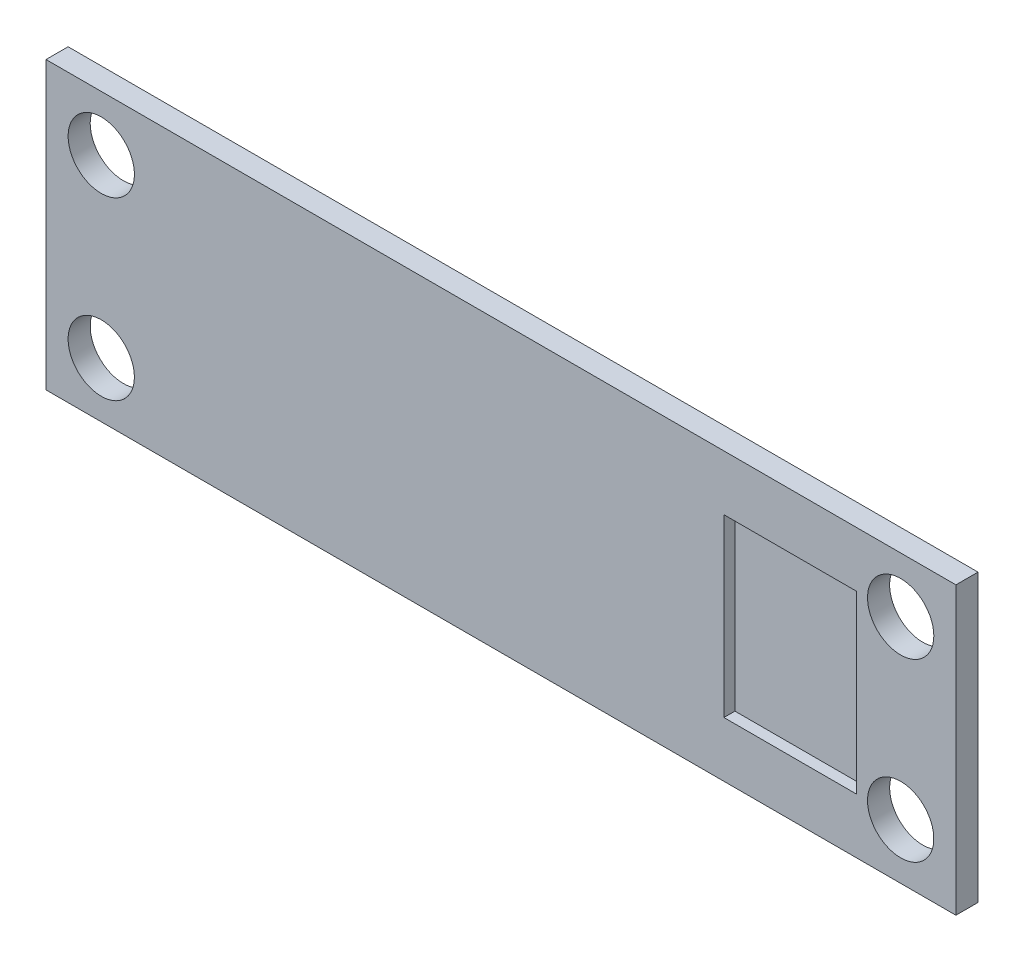
ISO-10303-21;
HEADER;
FILE_DESCRIPTION(('STEP AP214'),'2;1');
FILE_NAME('part.step','',(''),(''),'','','');
FILE_SCHEMA(('AUTOMOTIVE_DESIGN { 1 0 10303 214 1 1 1 1 }'));
ENDSEC;
DATA;
#1=APPLICATION_CONTEXT('core data for automotive mechanical design processes');
#2=APPLICATION_PROTOCOL_DEFINITION('international standard','automotive_design',2000,#1);
#3=PRODUCT_CONTEXT('',#1,'mechanical');
#4=PRODUCT('Part','Part','',(#3));
#5=PRODUCT_RELATED_PRODUCT_CATEGORY('part','',(#4));
#6=PRODUCT_DEFINITION_FORMATION('','',#4);
#7=PRODUCT_DEFINITION_CONTEXT('part definition',#1,'design');
#8=PRODUCT_DEFINITION('design','',#6,#7);
#9=PRODUCT_DEFINITION_SHAPE('','',#8);
#10=(LENGTH_UNIT() NAMED_UNIT(*) SI_UNIT(.MILLI.,.METRE.));
#11=(NAMED_UNIT(*) PLANE_ANGLE_UNIT() SI_UNIT($,.RADIAN.));
#12=(NAMED_UNIT(*) SI_UNIT($,.STERADIAN.) SOLID_ANGLE_UNIT());
#13=UNCERTAINTY_MEASURE_WITH_UNIT(LENGTH_MEASURE(1.E-05),#10,'distance_accuracy_value','');
#14=(GEOMETRIC_REPRESENTATION_CONTEXT(3) GLOBAL_UNCERTAINTY_ASSIGNED_CONTEXT((#13)) GLOBAL_UNIT_ASSIGNED_CONTEXT((#10,
#11,#12)) REPRESENTATION_CONTEXT('',''));
#15=CARTESIAN_POINT('',(0.,0.,0.));
#16=DIRECTION('',(0.,0.,1.));
#17=DIRECTION('',(1.,0.,0.));
#18=AXIS2_PLACEMENT_3D('',#15,#16,#17);
#19=CARTESIAN_POINT('',(0.,0.,1.));
#20=DIRECTION('',(0.,0.,1.));
#21=DIRECTION('',(1.,0.,0.));
#22=AXIS2_PLACEMENT_3D('',#19,#20,#21);
#23=PLANE('',#22);
#24=DIRECTION('',(-1.,0.,0.));
#25=VECTOR('',#24,1.);
#26=CARTESIAN_POINT('',(-10.5,10.45,1.));
#27=LINE('',#26,#25);
#28=CARTESIAN_POINT('',(-4.5,10.45,1.));
#29=VERTEX_POINT('',#28);
#30=CARTESIAN_POINT('',(-10.5,10.45,1.));
#31=VERTEX_POINT('',#30);
#32=EDGE_CURVE('E49',#29,#31,#27,.T.);
#33=ORIENTED_EDGE('',*,*,#32,.F.);
#34=DIRECTION('',(0.,1.,0.));
#35=VECTOR('',#34,1.);
#36=CARTESIAN_POINT('',(-4.5,10.45,1.));
#37=LINE('',#36,#35);
#38=CARTESIAN_POINT('',(-4.5,2.49999999999999,1.));
#39=VERTEX_POINT('',#38);
#40=EDGE_CURVE('E128',#39,#29,#37,.T.);
#41=ORIENTED_EDGE('',*,*,#40,.F.);
#42=DIRECTION('',(1.,0.,0.));
#43=VECTOR('',#42,1.);
#44=CARTESIAN_POINT('',(-4.5,2.49999999999999,1.));
#45=LINE('',#44,#43);
#46=CARTESIAN_POINT('',(-10.5,2.49999999999999,1.));
#47=VERTEX_POINT('',#46);
#48=EDGE_CURVE('E131',#47,#39,#45,.T.);
#49=ORIENTED_EDGE('',*,*,#48,.F.);
#50=DIRECTION('',(0.,-1.,0.));
#51=VECTOR('',#50,1.);
#52=CARTESIAN_POINT('',(-10.5,2.49999999999999,1.));
#53=LINE('',#52,#51);
#54=EDGE_CURVE('E137',#31,#47,#53,.T.);
#55=ORIENTED_EDGE('',*,*,#54,.F.);
#56=EDGE_LOOP('',(#33,#41,#49,#55));
#57=FACE_BOUND('',#56,.T.);
#58=CARTESIAN_POINT('',(-2.5,2.49999999999999,1.));
#59=DIRECTION('',(0.,0.,1.));
#60=DIRECTION('',(-1.,0.,0.));
#61=AXIS2_PLACEMENT_3D('',#58,#59,#60);
#62=CIRCLE('',#61,1.5);
#63=CARTESIAN_POINT('',(-4.,2.49999999999999,1.));
#64=VERTEX_POINT('',#63);
#65=EDGE_CURVE('E153',#64,#64,#62,.T.);
#66=ORIENTED_EDGE('',*,*,#65,.F.);
#67=EDGE_LOOP('',(#66));
#68=FACE_BOUND('',#67,.T.);
#69=CARTESIAN_POINT('',(-38.68,2.5,1.));
#70=DIRECTION('',(0.,0.,1.));
#71=DIRECTION('',(1.,0.,0.));
#72=AXIS2_PLACEMENT_3D('',#69,#70,#71);
#73=CIRCLE('',#72,1.5);
#74=CARTESIAN_POINT('',(-37.18,2.5,1.));
#75=VERTEX_POINT('',#74);
#76=EDGE_CURVE('E165',#75,#75,#73,.T.);
#77=ORIENTED_EDGE('',*,*,#76,.F.);
#78=EDGE_LOOP('',(#77));
#79=FACE_BOUND('',#78,.T.);
#80=DIRECTION('',(0.,1.,0.));
#81=VECTOR('',#80,1.);
#82=CARTESIAN_POINT('',(0.,0.,1.));
#83=LINE('',#82,#81);
#84=CARTESIAN_POINT('',(0.,0.,1.));
#85=VERTEX_POINT('',#84);
#86=CARTESIAN_POINT('',(0.,12.95,1.));
#87=VERTEX_POINT('',#86);
#88=EDGE_CURVE('E171',#85,#87,#83,.T.);
#89=ORIENTED_EDGE('',*,*,#88,.T.);
#90=DIRECTION('',(-1.,0.,0.));
#91=VECTOR('',#90,1.);
#92=CARTESIAN_POINT('',(0.,12.95,1.));
#93=LINE('',#92,#91);
#94=CARTESIAN_POINT('',(-41.18,12.95,1.));
#95=VERTEX_POINT('',#94);
#96=EDGE_CURVE('E86',#87,#95,#93,.T.);
#97=ORIENTED_EDGE('',*,*,#96,.T.);
#98=DIRECTION('',(0.,-1.,0.));
#99=VECTOR('',#98,1.);
#100=CARTESIAN_POINT('',(-41.18,0.,1.));
#101=LINE('',#100,#99);
#102=CARTESIAN_POINT('',(-41.18,0.,1.));
#103=VERTEX_POINT('',#102);
#104=EDGE_CURVE('E174',#95,#103,#101,.T.);
#105=ORIENTED_EDGE('',*,*,#104,.T.);
#106=DIRECTION('',(1.,0.,0.));
#107=VECTOR('',#106,1.);
#108=CARTESIAN_POINT('',(0.,0.,1.));
#109=LINE('',#108,#107);
#110=EDGE_CURVE('E58',#103,#85,#109,.T.);
#111=ORIENTED_EDGE('',*,*,#110,.T.);
#112=EDGE_LOOP('',(#89,#97,#105,#111));
#113=FACE_BOUND('',#112,.T.);
#114=CARTESIAN_POINT('',(-38.68,10.45,1.));
#115=DIRECTION('',(0.,0.,1.));
#116=DIRECTION('',(-1.,0.,0.));
#117=AXIS2_PLACEMENT_3D('',#114,#115,#116);
#118=CIRCLE('',#117,1.5);
#119=CARTESIAN_POINT('',(-40.18,10.45,1.));
#120=VERTEX_POINT('',#119);
#121=EDGE_CURVE('E159',#120,#120,#118,.T.);
#122=ORIENTED_EDGE('',*,*,#121,.F.);
#123=EDGE_LOOP('',(#122));
#124=FACE_BOUND('',#123,.T.);
#125=CARTESIAN_POINT('',(-2.5,10.45,1.));
#126=DIRECTION('',(0.,0.,1.));
#127=DIRECTION('',(1.,0.,0.));
#128=AXIS2_PLACEMENT_3D('',#125,#126,#127);
#129=CIRCLE('',#128,1.5);
#130=CARTESIAN_POINT('',(-1.,10.45,1.));
#131=VERTEX_POINT('',#130);
#132=EDGE_CURVE('E147',#131,#131,#129,.T.);
#133=ORIENTED_EDGE('',*,*,#132,.F.);
#134=EDGE_LOOP('',(#133));
#135=FACE_BOUND('',#134,.T.);
#136=ADVANCED_FACE('F34',(#57,#68,#79,#113,#124,#135),#23,.T.);
#137=CARTESIAN_POINT('',(0.,0.,0.));
#138=DIRECTION('',(0.,0.,1.));
#139=DIRECTION('',(1.,0.,0.));
#140=AXIS2_PLACEMENT_3D('',#137,#138,#139);
#141=PLANE('',#140);
#142=DIRECTION('',(0.,1.,0.));
#143=VECTOR('',#142,1.);
#144=CARTESIAN_POINT('',(0.,0.,0.));
#145=LINE('',#144,#143);
#146=CARTESIAN_POINT('',(0.,0.,0.));
#147=VERTEX_POINT('',#146);
#148=CARTESIAN_POINT('',(0.,12.95,0.));
#149=VERTEX_POINT('',#148);
#150=EDGE_CURVE('E168',#147,#149,#145,.T.);
#151=ORIENTED_EDGE('',*,*,#150,.F.);
#152=DIRECTION('',(1.,0.,0.));
#153=VECTOR('',#152,1.);
#154=CARTESIAN_POINT('',(0.,0.,0.));
#155=LINE('',#154,#153);
#156=CARTESIAN_POINT('',(-41.18,0.,0.));
#157=VERTEX_POINT('',#156);
#158=EDGE_CURVE('E79',#157,#147,#155,.T.);
#159=ORIENTED_EDGE('',*,*,#158,.F.);
#160=DIRECTION('',(0.,-1.,0.));
#161=VECTOR('',#160,1.);
#162=CARTESIAN_POINT('',(-41.18,0.,0.));
#163=LINE('',#162,#161);
#164=CARTESIAN_POINT('',(-41.18,12.95,0.));
#165=VERTEX_POINT('',#164);
#166=EDGE_CURVE('E182',#165,#157,#163,.T.);
#167=ORIENTED_EDGE('',*,*,#166,.F.);
#168=DIRECTION('',(-1.,0.,0.));
#169=VECTOR('',#168,1.);
#170=CARTESIAN_POINT('',(0.,12.95,0.));
#171=LINE('',#170,#169);
#172=EDGE_CURVE('E180',#149,#165,#171,.T.);
#173=ORIENTED_EDGE('',*,*,#172,.F.);
#174=EDGE_LOOP('',(#151,#159,#167,#173));
#175=FACE_BOUND('',#174,.T.);
#176=CARTESIAN_POINT('',(-38.68,2.5,0.));
#177=DIRECTION('',(0.,0.,1.));
#178=DIRECTION('',(1.,0.,0.));
#179=AXIS2_PLACEMENT_3D('',#176,#177,#178);
#180=CIRCLE('',#179,1.5);
#181=CARTESIAN_POINT('',(-37.18,2.5,0.));
#182=VERTEX_POINT('',#181);
#183=EDGE_CURVE('E162',#182,#182,#180,.T.);
#184=ORIENTED_EDGE('',*,*,#183,.T.);
#185=EDGE_LOOP('',(#184));
#186=FACE_BOUND('',#185,.T.);
#187=CARTESIAN_POINT('',(-38.68,10.45,0.));
#188=DIRECTION('',(0.,0.,1.));
#189=DIRECTION('',(-1.,0.,0.));
#190=AXIS2_PLACEMENT_3D('',#187,#188,#189);
#191=CIRCLE('',#190,1.5);
#192=CARTESIAN_POINT('',(-40.18,10.45,0.));
#193=VERTEX_POINT('',#192);
#194=EDGE_CURVE('E156',#193,#193,#191,.T.);
#195=ORIENTED_EDGE('',*,*,#194,.T.);
#196=EDGE_LOOP('',(#195));
#197=FACE_BOUND('',#196,.T.);
#198=CARTESIAN_POINT('',(-2.5,2.49999999999999,0.));
#199=DIRECTION('',(0.,0.,1.));
#200=DIRECTION('',(-1.,0.,0.));
#201=AXIS2_PLACEMENT_3D('',#198,#199,#200);
#202=CIRCLE('',#201,1.5);
#203=CARTESIAN_POINT('',(-4.,2.49999999999999,0.));
#204=VERTEX_POINT('',#203);
#205=EDGE_CURVE('E150',#204,#204,#202,.T.);
#206=ORIENTED_EDGE('',*,*,#205,.T.);
#207=EDGE_LOOP('',(#206));
#208=FACE_BOUND('',#207,.T.);
#209=CARTESIAN_POINT('',(-2.5,10.45,0.));
#210=DIRECTION('',(0.,0.,1.));
#211=DIRECTION('',(1.,0.,0.));
#212=AXIS2_PLACEMENT_3D('',#209,#210,#211);
#213=CIRCLE('',#212,1.5);
#214=CARTESIAN_POINT('',(-1.,10.45,0.));
#215=VERTEX_POINT('',#214);
#216=EDGE_CURVE('E143',#215,#215,#213,.T.);
#217=ORIENTED_EDGE('',*,*,#216,.T.);
#218=EDGE_LOOP('',(#217));
#219=FACE_BOUND('',#218,.T.);
#220=ADVANCED_FACE('F195',(#175,#186,#197,#208,#219),#141,.F.);
#221=CARTESIAN_POINT('',(0.,0.,1.));
#222=DIRECTION('',(-1.,0.,0.));
#223=DIRECTION('',(0.,0.,1.));
#224=AXIS2_PLACEMENT_3D('',#221,#222,#223);
#225=PLANE('',#224);
#226=ORIENTED_EDGE('',*,*,#150,.T.);
#227=DIRECTION('',(0.,0.,-1.));
#228=VECTOR('',#227,1.);
#229=CARTESIAN_POINT('',(0.,12.95,1.));
#230=LINE('',#229,#228);
#231=EDGE_CURVE('E11',#87,#149,#230,.T.);
#232=ORIENTED_EDGE('',*,*,#231,.F.);
#233=ORIENTED_EDGE('',*,*,#88,.F.);
#234=DIRECTION('',(0.,0.,-1.));
#235=VECTOR('',#234,1.);
#236=CARTESIAN_POINT('',(0.,0.,1.));
#237=LINE('',#236,#235);
#238=EDGE_CURVE('E177',#85,#147,#237,.T.);
#239=ORIENTED_EDGE('',*,*,#238,.T.);
#240=EDGE_LOOP('',(#226,#232,#233,#239));
#241=FACE_BOUND('',#240,.T.);
#242=ADVANCED_FACE('F36',(#241),#225,.F.);
#243=CARTESIAN_POINT('',(0.,12.95,1.));
#244=DIRECTION('',(0.,-1.,0.));
#245=DIRECTION('',(1.,0.,0.));
#246=AXIS2_PLACEMENT_3D('',#243,#244,#245);
#247=PLANE('',#246);
#248=ORIENTED_EDGE('',*,*,#172,.T.);
#249=DIRECTION('',(0.,0.,-1.));
#250=VECTOR('',#249,1.);
#251=CARTESIAN_POINT('',(-41.18,12.95,1.));
#252=LINE('',#251,#250);
#253=EDGE_CURVE('E42',#95,#165,#252,.T.);
#254=ORIENTED_EDGE('',*,*,#253,.F.);
#255=ORIENTED_EDGE('',*,*,#96,.F.);
#256=ORIENTED_EDGE('',*,*,#231,.T.);
#257=EDGE_LOOP('',(#248,#254,#255,#256));
#258=FACE_BOUND('',#257,.T.);
#259=ADVANCED_FACE('F211',(#258),#247,.F.);
#260=CARTESIAN_POINT('',(-41.18,0.,1.));
#261=DIRECTION('',(1.,0.,0.));
#262=DIRECTION('',(0.,0.,-1.));
#263=AXIS2_PLACEMENT_3D('',#260,#261,#262);
#264=PLANE('',#263);
#265=ORIENTED_EDGE('',*,*,#166,.T.);
#266=DIRECTION('',(0.,0.,-1.));
#267=VECTOR('',#266,1.);
#268=CARTESIAN_POINT('',(-41.18,0.,1.));
#269=LINE('',#268,#267);
#270=EDGE_CURVE('E186',#103,#157,#269,.T.);
#271=ORIENTED_EDGE('',*,*,#270,.F.);
#272=ORIENTED_EDGE('',*,*,#104,.F.);
#273=ORIENTED_EDGE('',*,*,#253,.T.);
#274=EDGE_LOOP('',(#265,#271,#272,#273));
#275=FACE_BOUND('',#274,.T.);
#276=ADVANCED_FACE('F191',(#275),#264,.F.);
#277=CARTESIAN_POINT('',(0.,0.,1.));
#278=DIRECTION('',(0.,1.,0.));
#279=DIRECTION('',(-1.,0.,0.));
#280=AXIS2_PLACEMENT_3D('',#277,#278,#279);
#281=PLANE('',#280);
#282=ORIENTED_EDGE('',*,*,#158,.T.);
#283=ORIENTED_EDGE('',*,*,#238,.F.);
#284=ORIENTED_EDGE('',*,*,#110,.F.);
#285=ORIENTED_EDGE('',*,*,#270,.T.);
#286=EDGE_LOOP('',(#282,#283,#284,#285));
#287=FACE_BOUND('',#286,.T.);
#288=ADVANCED_FACE('F200',(#287),#281,.F.);
#289=CARTESIAN_POINT('',(-38.68,2.5,1.));
#290=DIRECTION('',(0.,0.,-1.));
#291=DIRECTION('',(-1.,0.,0.));
#292=AXIS2_PLACEMENT_3D('',#289,#290,#291);
#293=CYLINDRICAL_SURFACE('',#292,1.5);
#294=ORIENTED_EDGE('',*,*,#76,.T.);
#295=EDGE_LOOP('',(#294));
#296=FACE_BOUND('',#295,.T.);
#297=ORIENTED_EDGE('',*,*,#183,.F.);
#298=EDGE_LOOP('',(#297));
#299=FACE_BOUND('',#298,.T.);
#300=ADVANCED_FACE('F202',(#296,#299),#293,.F.);
#301=CARTESIAN_POINT('',(-38.68,10.45,1.));
#302=DIRECTION('',(0.,0.,-1.));
#303=DIRECTION('',(-1.,0.,0.));
#304=AXIS2_PLACEMENT_3D('',#301,#302,#303);
#305=CYLINDRICAL_SURFACE('',#304,1.5);
#306=ORIENTED_EDGE('',*,*,#121,.T.);
#307=EDGE_LOOP('',(#306));
#308=FACE_BOUND('',#307,.T.);
#309=ORIENTED_EDGE('',*,*,#194,.F.);
#310=EDGE_LOOP('',(#309));
#311=FACE_BOUND('',#310,.T.);
#312=ADVANCED_FACE('F208',(#308,#311),#305,.F.);
#313=CARTESIAN_POINT('',(-2.5,2.49999999999999,1.));
#314=DIRECTION('',(0.,0.,-1.));
#315=DIRECTION('',(-1.,0.,0.));
#316=AXIS2_PLACEMENT_3D('',#313,#314,#315);
#317=CYLINDRICAL_SURFACE('',#316,1.5);
#318=ORIENTED_EDGE('',*,*,#65,.T.);
#319=EDGE_LOOP('',(#318));
#320=FACE_BOUND('',#319,.T.);
#321=ORIENTED_EDGE('',*,*,#205,.F.);
#322=EDGE_LOOP('',(#321));
#323=FACE_BOUND('',#322,.T.);
#324=ADVANCED_FACE('F224',(#320,#323),#317,.F.);
#325=CARTESIAN_POINT('',(-2.5,10.45,1.));
#326=DIRECTION('',(0.,0.,-1.));
#327=DIRECTION('',(-1.,0.,0.));
#328=AXIS2_PLACEMENT_3D('',#325,#326,#327);
#329=CYLINDRICAL_SURFACE('',#328,1.5);
#330=ORIENTED_EDGE('',*,*,#132,.T.);
#331=EDGE_LOOP('',(#330));
#332=FACE_BOUND('',#331,.T.);
#333=ORIENTED_EDGE('',*,*,#216,.F.);
#334=EDGE_LOOP('',(#333));
#335=FACE_BOUND('',#334,.T.);
#336=ADVANCED_FACE('F228',(#332,#335),#329,.F.);
#337=CARTESIAN_POINT('',(-10.5,10.45,0.5));
#338=DIRECTION('',(0.,1.,0.));
#339=DIRECTION('',(-1.,0.,0.));
#340=AXIS2_PLACEMENT_3D('',#337,#338,#339);
#341=PLANE('',#340);
#342=ORIENTED_EDGE('',*,*,#32,.T.);
#343=DIRECTION('',(0.,0.,1.));
#344=VECTOR('',#343,1.);
#345=CARTESIAN_POINT('',(-10.5,10.45,0.5));
#346=LINE('',#345,#344);
#347=CARTESIAN_POINT('',(-10.5,10.45,0.5));
#348=VERTEX_POINT('',#347);
#349=EDGE_CURVE('E106',#348,#31,#346,.T.);
#350=ORIENTED_EDGE('',*,*,#349,.F.);
#351=DIRECTION('',(-1.,0.,0.));
#352=VECTOR('',#351,1.);
#353=CARTESIAN_POINT('',(-10.5,10.45,0.5));
#354=LINE('',#353,#352);
#355=CARTESIAN_POINT('',(-4.5,10.45,0.5));
#356=VERTEX_POINT('',#355);
#357=EDGE_CURVE('E110',#356,#348,#354,.T.);
#358=ORIENTED_EDGE('',*,*,#357,.F.);
#359=DIRECTION('',(0.,0.,1.));
#360=VECTOR('',#359,1.);
#361=CARTESIAN_POINT('',(-4.5,10.45,0.5));
#362=LINE('',#361,#360);
#363=EDGE_CURVE('E141',#356,#29,#362,.T.);
#364=ORIENTED_EDGE('',*,*,#363,.T.);
#365=EDGE_LOOP('',(#342,#350,#358,#364));
#366=FACE_BOUND('',#365,.T.);
#367=ADVANCED_FACE('F108',(#366),#341,.F.);
#368=CARTESIAN_POINT('',(-4.5,10.45,0.5));
#369=DIRECTION('',(1.,0.,0.));
#370=DIRECTION('',(0.,1.,0.));
#371=AXIS2_PLACEMENT_3D('',#368,#369,#370);
#372=PLANE('',#371);
#373=ORIENTED_EDGE('',*,*,#40,.T.);
#374=ORIENTED_EDGE('',*,*,#363,.F.);
#375=DIRECTION('',(0.,1.,0.));
#376=VECTOR('',#375,1.);
#377=CARTESIAN_POINT('',(-4.5,10.45,0.5));
#378=LINE('',#377,#376);
#379=CARTESIAN_POINT('',(-4.5,2.49999999999999,0.5));
#380=VERTEX_POINT('',#379);
#381=EDGE_CURVE('E116',#380,#356,#378,.T.);
#382=ORIENTED_EDGE('',*,*,#381,.F.);
#383=DIRECTION('',(0.,0.,1.));
#384=VECTOR('',#383,1.);
#385=CARTESIAN_POINT('',(-4.5,2.49999999999999,0.5));
#386=LINE('',#385,#384);
#387=EDGE_CURVE('E144',#380,#39,#386,.T.);
#388=ORIENTED_EDGE('',*,*,#387,.T.);
#389=EDGE_LOOP('',(#373,#374,#382,#388));
#390=FACE_BOUND('',#389,.T.);
#391=ADVANCED_FACE('F235',(#390),#372,.F.);
#392=CARTESIAN_POINT('',(-4.5,2.49999999999999,0.5));
#393=DIRECTION('',(0.,-1.,0.));
#394=DIRECTION('',(1.,0.,0.));
#395=AXIS2_PLACEMENT_3D('',#392,#393,#394);
#396=PLANE('',#395);
#397=ORIENTED_EDGE('',*,*,#48,.T.);
#398=ORIENTED_EDGE('',*,*,#387,.F.);
#399=DIRECTION('',(1.,0.,0.));
#400=VECTOR('',#399,1.);
#401=CARTESIAN_POINT('',(-4.5,2.49999999999999,0.5));
#402=LINE('',#401,#400);
#403=CARTESIAN_POINT('',(-10.5,2.49999999999999,0.5));
#404=VERTEX_POINT('',#403);
#405=EDGE_CURVE('E124',#404,#380,#402,.T.);
#406=ORIENTED_EDGE('',*,*,#405,.F.);
#407=DIRECTION('',(0.,0.,1.));
#408=VECTOR('',#407,1.);
#409=CARTESIAN_POINT('',(-10.5,2.49999999999999,0.5));
#410=LINE('',#409,#408);
#411=EDGE_CURVE('E115',#404,#47,#410,.T.);
#412=ORIENTED_EDGE('',*,*,#411,.T.);
#413=EDGE_LOOP('',(#397,#398,#406,#412));
#414=FACE_BOUND('',#413,.T.);
#415=ADVANCED_FACE('F238',(#414),#396,.F.);
#416=CARTESIAN_POINT('',(-10.5,2.49999999999999,0.5));
#417=DIRECTION('',(-1.,0.,0.));
#418=DIRECTION('',(0.,0.,1.));
#419=AXIS2_PLACEMENT_3D('',#416,#417,#418);
#420=PLANE('',#419);
#421=ORIENTED_EDGE('',*,*,#54,.T.);
#422=ORIENTED_EDGE('',*,*,#411,.F.);
#423=DIRECTION('',(0.,-1.,0.));
#424=VECTOR('',#423,1.);
#425=CARTESIAN_POINT('',(-10.5,2.49999999999999,0.5));
#426=LINE('',#425,#424);
#427=EDGE_CURVE('E119',#348,#404,#426,.T.);
#428=ORIENTED_EDGE('',*,*,#427,.F.);
#429=ORIENTED_EDGE('',*,*,#349,.T.);
#430=EDGE_LOOP('',(#421,#422,#428,#429));
#431=FACE_BOUND('',#430,.T.);
#432=ADVANCED_FACE('F120',(#431),#420,.F.);
#433=CARTESIAN_POINT('',(0.,0.,0.5));
#434=DIRECTION('',(0.,0.,-1.));
#435=DIRECTION('',(-1.,0.,0.));
#436=AXIS2_PLACEMENT_3D('',#433,#434,#435);
#437=PLANE('',#436);
#438=ORIENTED_EDGE('',*,*,#357,.T.);
#439=ORIENTED_EDGE('',*,*,#427,.T.);
#440=ORIENTED_EDGE('',*,*,#405,.T.);
#441=ORIENTED_EDGE('',*,*,#381,.T.);
#442=EDGE_LOOP('',(#438,#439,#440,#441));
#443=FACE_BOUND('',#442,.T.);
#444=ADVANCED_FACE('F126',(#443),#437,.F.);
#445=CLOSED_SHELL('',(#136,#220,#242,#259,#276,#288,#300,#312,#324,#336,#367,#391,#415,#432,#444));
#446=MANIFOLD_SOLID_BREP('B2',#445);
#447=ADVANCED_BREP_SHAPE_REPRESENTATION('',(#18,#446),#14);
#448=SHAPE_DEFINITION_REPRESENTATION(#9,#447);
ENDSEC;
END-ISO-10303-21;
